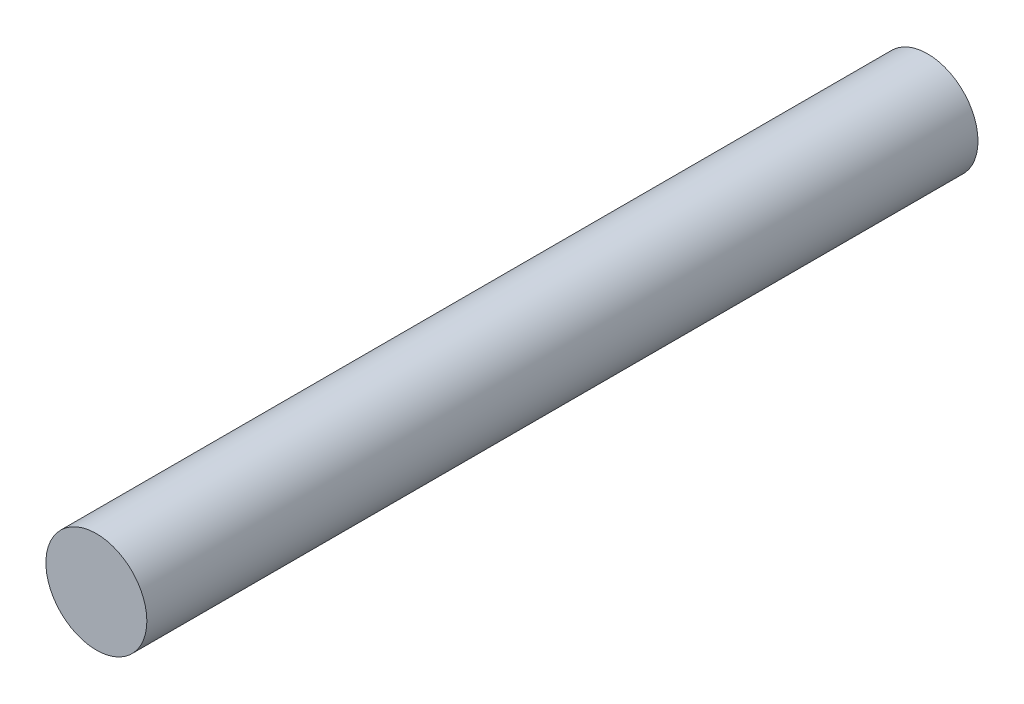
ISO-10303-21;
HEADER;
FILE_DESCRIPTION(('STEP AP214'),'2;1');
FILE_NAME('part.step','',(''),(''),'','','');
FILE_SCHEMA(('AUTOMOTIVE_DESIGN { 1 0 10303 214 1 1 1 1 }'));
ENDSEC;
DATA;
#1=APPLICATION_CONTEXT('core data for automotive mechanical design processes');
#2=APPLICATION_PROTOCOL_DEFINITION('international standard','automotive_design',2000,#1);
#3=PRODUCT_CONTEXT('',#1,'mechanical');
#4=PRODUCT('Part','Part','',(#3));
#5=PRODUCT_RELATED_PRODUCT_CATEGORY('part','',(#4));
#6=PRODUCT_DEFINITION_FORMATION('','',#4);
#7=PRODUCT_DEFINITION_CONTEXT('part definition',#1,'design');
#8=PRODUCT_DEFINITION('design','',#6,#7);
#9=PRODUCT_DEFINITION_SHAPE('','',#8);
#10=(LENGTH_UNIT() NAMED_UNIT(*) SI_UNIT(.MILLI.,.METRE.));
#11=(NAMED_UNIT(*) PLANE_ANGLE_UNIT() SI_UNIT($,.RADIAN.));
#12=(NAMED_UNIT(*) SI_UNIT($,.STERADIAN.) SOLID_ANGLE_UNIT());
#13=UNCERTAINTY_MEASURE_WITH_UNIT(LENGTH_MEASURE(1.E-05),#10,'distance_accuracy_value','');
#14=(GEOMETRIC_REPRESENTATION_CONTEXT(3) GLOBAL_UNCERTAINTY_ASSIGNED_CONTEXT((#13)) GLOBAL_UNIT_ASSIGNED_CONTEXT((#10,
#11,#12)) REPRESENTATION_CONTEXT('',''));
#15=CARTESIAN_POINT('',(0.,0.,0.));
#16=DIRECTION('',(0.,0.,1.));
#17=DIRECTION('',(1.,0.,0.));
#18=AXIS2_PLACEMENT_3D('',#15,#16,#17);
#19=CARTESIAN_POINT('',(0.,0.,-113.2));
#20=DIRECTION('',(0.,0.,1.));
#21=DIRECTION('',(1.,0.,0.));
#22=AXIS2_PLACEMENT_3D('',#19,#20,#21);
#23=CYLINDRICAL_SURFACE('',#22,8.89);
#24=CARTESIAN_POINT('',(0.,0.,-113.2));
#25=DIRECTION('',(0.,0.,1.));
#26=DIRECTION('',(1.,0.,0.));
#27=AXIS2_PLACEMENT_3D('',#24,#25,#26);
#28=CIRCLE('',#27,8.89);
#29=CARTESIAN_POINT('',(8.89,0.,-113.2));
#30=VERTEX_POINT('',#29);
#31=EDGE_CURVE('E10',#30,#30,#28,.T.);
#32=CARTESIAN_POINT('',(0.,0.,33.2));
#33=DIRECTION('',(0.,0.,1.));
#34=DIRECTION('',(1.,0.,0.));
#35=AXIS2_PLACEMENT_3D('',#32,#33,#34);
#36=CIRCLE('',#35,8.89);
#37=CARTESIAN_POINT('',(8.89,0.,33.2));
#38=VERTEX_POINT('',#37);
#39=EDGE_CURVE('E50',#38,#38,#36,.T.);
#40=CARTESIAN_POINT('',(8.89,0.,-113.2));
#41=CARTESIAN_POINT('',(8.89,0.,-111.675));
#42=CARTESIAN_POINT('',(8.89,0.,-110.15));
#43=CARTESIAN_POINT('',(8.89,0.,-107.1));
#44=CARTESIAN_POINT('',(8.89,0.,-105.575));
#45=CARTESIAN_POINT('',(8.89,0.,-102.525));
#46=CARTESIAN_POINT('',(8.89,0.,-101.));
#47=CARTESIAN_POINT('',(8.89,0.,-97.95));
#48=CARTESIAN_POINT('',(8.89,0.,-96.425));
#49=CARTESIAN_POINT('',(8.89,0.,-93.375));
#50=CARTESIAN_POINT('',(8.89,0.,-91.85));
#51=CARTESIAN_POINT('',(8.89,0.,-88.8));
#52=CARTESIAN_POINT('',(8.89,0.,-87.275));
#53=CARTESIAN_POINT('',(8.89,0.,-84.225));
#54=CARTESIAN_POINT('',(8.89,0.,-82.7));
#55=CARTESIAN_POINT('',(8.89,0.,-79.65));
#56=CARTESIAN_POINT('',(8.89,0.,-78.125));
#57=CARTESIAN_POINT('',(8.89,0.,-75.075));
#58=CARTESIAN_POINT('',(8.89,0.,-73.55));
#59=CARTESIAN_POINT('',(8.89,0.,-70.5));
#60=CARTESIAN_POINT('',(8.89,0.,-68.975));
#61=CARTESIAN_POINT('',(8.89,0.,-65.925));
#62=CARTESIAN_POINT('',(8.89,0.,-64.4));
#63=CARTESIAN_POINT('',(8.89,0.,-61.35));
#64=CARTESIAN_POINT('',(8.89,0.,-59.825));
#65=CARTESIAN_POINT('',(8.89,0.,-56.775));
#66=CARTESIAN_POINT('',(8.89,0.,-55.25));
#67=CARTESIAN_POINT('',(8.89,0.,-52.2));
#68=CARTESIAN_POINT('',(8.89,0.,-50.675));
#69=CARTESIAN_POINT('',(8.89,0.,-47.625));
#70=CARTESIAN_POINT('',(8.89,0.,-46.1));
#71=CARTESIAN_POINT('',(8.89,0.,-43.05));
#72=CARTESIAN_POINT('',(8.89,0.,-41.525));
#73=CARTESIAN_POINT('',(8.89,0.,-38.475));
#74=CARTESIAN_POINT('',(8.89,0.,-36.95));
#75=CARTESIAN_POINT('',(8.89,0.,-33.9));
#76=CARTESIAN_POINT('',(8.89,0.,-32.375));
#77=CARTESIAN_POINT('',(8.89,0.,-29.325));
#78=CARTESIAN_POINT('',(8.89,0.,-27.8));
#79=CARTESIAN_POINT('',(8.89,0.,-24.75));
#80=CARTESIAN_POINT('',(8.89,0.,-23.225));
#81=CARTESIAN_POINT('',(8.89,0.,-20.175));
#82=CARTESIAN_POINT('',(8.89,0.,-18.65));
#83=CARTESIAN_POINT('',(8.89,0.,-15.6));
#84=CARTESIAN_POINT('',(8.89,0.,-14.075));
#85=CARTESIAN_POINT('',(8.89,0.,-11.025));
#86=CARTESIAN_POINT('',(8.89,0.,-9.50000000000001));
#87=CARTESIAN_POINT('',(8.89,0.,-6.45000000000001));
#88=CARTESIAN_POINT('',(8.89,0.,-4.92500000000001));
#89=CARTESIAN_POINT('',(8.89,0.,-1.87500000000002));
#90=CARTESIAN_POINT('',(8.89,0.,-0.350000000000017));
#91=CARTESIAN_POINT('',(8.89,0.,2.69999999999998));
#92=CARTESIAN_POINT('',(8.89,0.,4.22499999999998));
#93=CARTESIAN_POINT('',(8.89,0.,7.27499999999998));
#94=CARTESIAN_POINT('',(8.89,0.,8.79999999999997));
#95=CARTESIAN_POINT('',(8.89,0.,11.85));
#96=CARTESIAN_POINT('',(8.89,0.,13.375));
#97=CARTESIAN_POINT('',(8.89,0.,16.425));
#98=CARTESIAN_POINT('',(8.89,0.,17.95));
#99=CARTESIAN_POINT('',(8.89,0.,21.));
#100=CARTESIAN_POINT('',(8.89,0.,22.525));
#101=CARTESIAN_POINT('',(8.89,0.,25.575));
#102=CARTESIAN_POINT('',(8.89,0.,27.1));
#103=CARTESIAN_POINT('',(8.89,0.,30.15));
#104=CARTESIAN_POINT('',(8.89,0.,31.675));
#105=CARTESIAN_POINT('',(8.89,0.,33.2));
#106=B_SPLINE_CURVE_WITH_KNOTS('',3,(#40,#41,#42,#43,#44,#45,#46,#47,#48,#49,#50,#51,#52,#53,
#54,#55,#56,#57,#58,#59,#60,#61,#62,#63,#64,#65,#66,#67,#68,#69,#70,#71,#72,#73,#74,#75,#76,#77,
#78,#79,#80,#81,#82,#83,#84,#85,#86,#87,#88,#89,#90,#91,#92,#93,#94,#95,#96,#97,#98,#99,#100,
#101,#102,#103,#104,#105),.UNSPECIFIED.,.F.,.F.,(4,2,2,2,2,2,2,2,2,2,2,2,2,2,2,2,2,2,2,2,2,2,2,
2,2,2,2,2,2,2,2,2,4),(0.,4.575,9.14999999999999,13.725,18.3,22.875,27.45,32.025,36.6,41.175,
45.75,50.325,54.9,59.475,64.05,68.6249999999999,73.1999999999999,77.7749999999999,
82.3499999999999,86.9249999999999,91.4999999999999,96.0749999999999,100.65,105.225,109.8,
114.375,118.95,123.525,128.1,132.675,137.25,141.825,146.4),.UNSPECIFIED.);
#107=EDGE_CURVE('BSEAM43',#30,#38,#106,.T.);
#108=ORIENTED_EDGE('',*,*,#31,.T.);
#109=ORIENTED_EDGE('',*,*,#39,.F.);
#110=ORIENTED_EDGE('',*,*,#107,.T.);
#111=ORIENTED_EDGE('',*,*,#107,.F.);
#112=EDGE_LOOP('',(#108,#110,#109,#111));
#113=FACE_BOUND('',#112,.T.);
#114=ADVANCED_FACE('F43',(#113),#23,.T.);
#115=CARTESIAN_POINT('',(0.,0.,-113.2));
#116=DIRECTION('',(0.,0.,1.));
#117=DIRECTION('',(1.,0.,0.));
#118=AXIS2_PLACEMENT_3D('',#115,#116,#117);
#119=PLANE('',#118);
#120=ORIENTED_EDGE('',*,*,#31,.F.);
#121=EDGE_LOOP('',(#120));
#122=FACE_BOUND('',#121,.T.);
#123=ADVANCED_FACE('F60',(#122),#119,.F.);
#124=CARTESIAN_POINT('',(0.,0.,33.2));
#125=DIRECTION('',(0.,0.,1.));
#126=DIRECTION('',(1.,0.,0.));
#127=AXIS2_PLACEMENT_3D('',#124,#125,#126);
#128=PLANE('',#127);
#129=ORIENTED_EDGE('',*,*,#39,.T.);
#130=EDGE_LOOP('',(#129));
#131=FACE_BOUND('',#130,.T.);
#132=ADVANCED_FACE('F57',(#131),#128,.T.);
#133=CLOSED_SHELL('',(#114,#123,#132));
#134=MANIFOLD_SOLID_BREP('B2',#133);
#135=ADVANCED_BREP_SHAPE_REPRESENTATION('',(#18,#134),#14);
#136=SHAPE_DEFINITION_REPRESENTATION(#9,#135);
ENDSEC;
END-ISO-10303-21;
